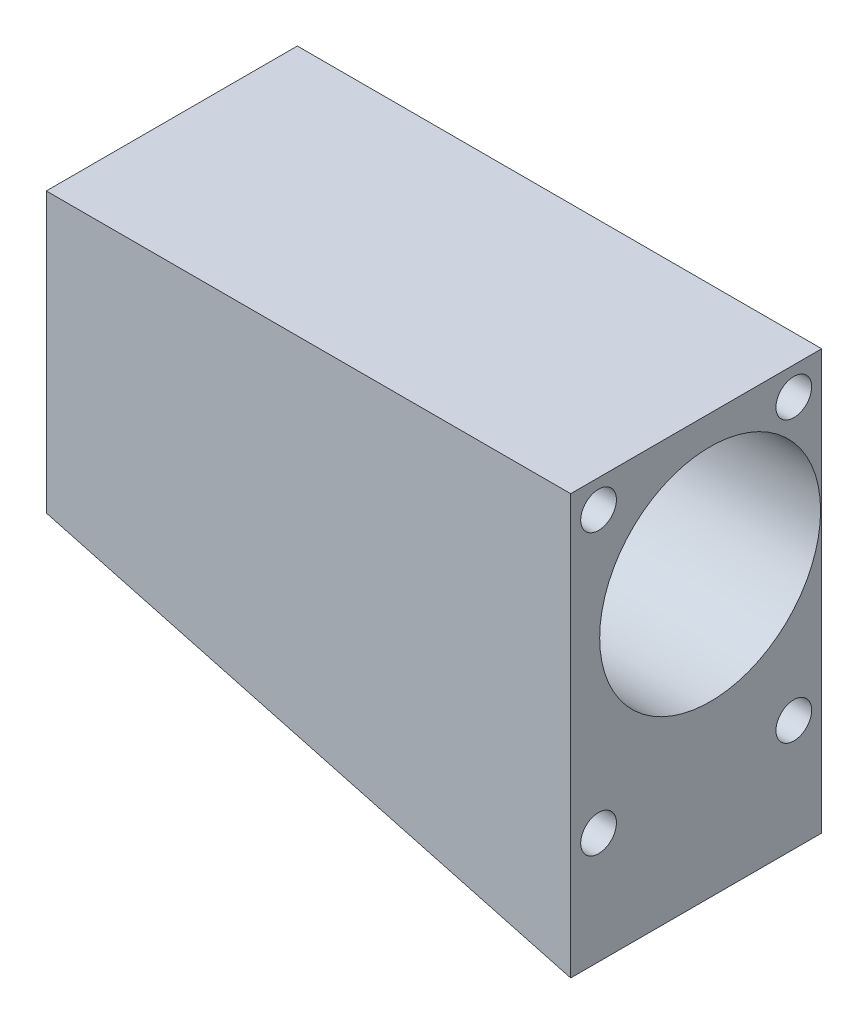
ISO-10303-21;
HEADER;
FILE_DESCRIPTION(('STEP AP214'),'2;1');
FILE_NAME('part.step','',(''),(''),'','','');
FILE_SCHEMA(('AUTOMOTIVE_DESIGN { 1 0 10303 214 1 1 1 1 }'));
ENDSEC;
DATA;
#1=APPLICATION_CONTEXT('core data for automotive mechanical design processes');
#2=APPLICATION_PROTOCOL_DEFINITION('international standard','automotive_design',2000,#1);
#3=PRODUCT_CONTEXT('',#1,'mechanical');
#4=PRODUCT('Part','Part','',(#3));
#5=PRODUCT_RELATED_PRODUCT_CATEGORY('part','',(#4));
#6=PRODUCT_DEFINITION_FORMATION('','',#4);
#7=PRODUCT_DEFINITION_CONTEXT('part definition',#1,'design');
#8=PRODUCT_DEFINITION('design','',#6,#7);
#9=PRODUCT_DEFINITION_SHAPE('','',#8);
#10=(LENGTH_UNIT() NAMED_UNIT(*) SI_UNIT(.MILLI.,.METRE.));
#11=(NAMED_UNIT(*) PLANE_ANGLE_UNIT() SI_UNIT($,.RADIAN.));
#12=(NAMED_UNIT(*) SI_UNIT($,.STERADIAN.) SOLID_ANGLE_UNIT());
#13=UNCERTAINTY_MEASURE_WITH_UNIT(LENGTH_MEASURE(1.E-05),#10,'distance_accuracy_value','');
#14=(GEOMETRIC_REPRESENTATION_CONTEXT(3) GLOBAL_UNCERTAINTY_ASSIGNED_CONTEXT((#13)) GLOBAL_UNIT_ASSIGNED_CONTEXT((#10,
#11,#12)) REPRESENTATION_CONTEXT('',''));
#15=CARTESIAN_POINT('',(0.,0.,0.));
#16=DIRECTION('',(0.,0.,1.));
#17=DIRECTION('',(1.,0.,0.));
#18=AXIS2_PLACEMENT_3D('',#15,#16,#17);
#19=CARTESIAN_POINT('',(0.,31.75,-28.575));
#20=DIRECTION('',(0.,1.,0.));
#21=DIRECTION('',(0.,0.,1.));
#22=AXIS2_PLACEMENT_3D('',#19,#20,#21);
#23=PLANE('',#22);
#24=DIRECTION('',(-1.,0.,0.));
#25=VECTOR('',#24,1.);
#26=CARTESIAN_POINT('',(0.,31.75,0.));
#27=LINE('',#26,#25);
#28=CARTESIAN_POINT('',(57.15,31.75,0.));
#29=VERTEX_POINT('',#28);
#30=CARTESIAN_POINT('',(-2.54,31.75,0.));
#31=VERTEX_POINT('',#30);
#32=EDGE_CURVE('E74',#29,#31,#27,.T.);
#33=ORIENTED_EDGE('',*,*,#32,.F.);
#34=DIRECTION('',(0.,0.,1.));
#35=VECTOR('',#34,1.);
#36=CARTESIAN_POINT('',(57.15,31.75,-28.575));
#37=LINE('',#36,#35);
#38=CARTESIAN_POINT('',(57.15,31.75,-28.575));
#39=VERTEX_POINT('',#38);
#40=EDGE_CURVE('E11',#39,#29,#37,.T.);
#41=ORIENTED_EDGE('',*,*,#40,.F.);
#42=DIRECTION('',(-1.,0.,0.));
#43=VECTOR('',#42,1.);
#44=CARTESIAN_POINT('',(0.,31.75,-28.575));
#45=LINE('',#44,#43);
#46=CARTESIAN_POINT('',(-2.54,31.75,-28.575));
#47=VERTEX_POINT('',#46);
#48=EDGE_CURVE('E41',#39,#47,#45,.T.);
#49=ORIENTED_EDGE('',*,*,#48,.T.);
#50=DIRECTION('',(0.,0.,1.));
#51=VECTOR('',#50,1.);
#52=CARTESIAN_POINT('',(-2.54,31.75,-28.575));
#53=LINE('',#52,#51);
#54=EDGE_CURVE('E102',#47,#31,#53,.T.);
#55=ORIENTED_EDGE('',*,*,#54,.T.);
#56=EDGE_LOOP('',(#33,#41,#49,#55));
#57=FACE_BOUND('',#56,.T.);
#58=ADVANCED_FACE('F32',(#57),#23,.T.);
#59=CARTESIAN_POINT('',(57.15,0.,-28.575));
#60=DIRECTION('',(1.,0.,0.));
#61=DIRECTION('',(0.,0.,-1.));
#62=AXIS2_PLACEMENT_3D('',#59,#60,#61);
#63=PLANE('',#62);
#64=CARTESIAN_POINT('',(57.15,28.575,-25.4));
#65=DIRECTION('',(1.,0.,0.));
#66=DIRECTION('',(0.,0.,-1.));
#67=AXIS2_PLACEMENT_3D('',#64,#65,#66);
#68=CIRCLE('',#67,2.032);
#69=CARTESIAN_POINT('',(57.15,28.575,-27.432));
#70=VERTEX_POINT('',#69);
#71=EDGE_CURVE('E186',#70,#70,#68,.T.);
#72=ORIENTED_EDGE('',*,*,#71,.F.);
#73=EDGE_LOOP('',(#72));
#74=FACE_BOUND('',#73,.T.);
#75=CARTESIAN_POINT('',(57.15,-3.29388729621329,-25.4));
#76=DIRECTION('',(1.,0.,0.));
#77=DIRECTION('',(0.,0.,-1.));
#78=AXIS2_PLACEMENT_3D('',#75,#76,#77);
#79=CIRCLE('',#78,2.032);
#80=CARTESIAN_POINT('',(57.15,-3.29388729621329,-27.432));
#81=VERTEX_POINT('',#80);
#82=EDGE_CURVE('E195',#81,#81,#79,.T.);
#83=ORIENTED_EDGE('',*,*,#82,.F.);
#84=EDGE_LOOP('',(#83));
#85=FACE_BOUND('',#84,.T.);
#86=CARTESIAN_POINT('',(57.15,-3.29388729621329,-3.175));
#87=DIRECTION('',(1.,0.,0.));
#88=DIRECTION('',(0.,0.,-1.));
#89=AXIS2_PLACEMENT_3D('',#86,#87,#88);
#90=CIRCLE('',#89,2.032);
#91=CARTESIAN_POINT('',(57.15,-3.29388729621329,-5.207));
#92=VERTEX_POINT('',#91);
#93=EDGE_CURVE('E201',#92,#92,#90,.T.);
#94=ORIENTED_EDGE('',*,*,#93,.F.);
#95=EDGE_LOOP('',(#94));
#96=FACE_BOUND('',#95,.T.);
#97=CARTESIAN_POINT('',(57.15,28.575,-3.175));
#98=DIRECTION('',(1.,0.,0.));
#99=DIRECTION('',(0.,0.,-1.));
#100=AXIS2_PLACEMENT_3D('',#97,#98,#99);
#101=CIRCLE('',#100,2.032);
#102=CARTESIAN_POINT('',(57.15,28.575,-5.207));
#103=VERTEX_POINT('',#102);
#104=EDGE_CURVE('E94',#103,#103,#101,.T.);
#105=ORIENTED_EDGE('',*,*,#104,.F.);
#106=EDGE_LOOP('',(#105));
#107=FACE_BOUND('',#106,.T.);
#108=CARTESIAN_POINT('',(57.15,15.875,-15.875));
#109=DIRECTION('',(-1.,0.,0.));
#110=DIRECTION('',(0.,0.,1.));
#111=AXIS2_PLACEMENT_3D('',#108,#109,#110);
#112=CIRCLE('',#111,12.573);
#113=CARTESIAN_POINT('',(57.15,15.875,-3.302));
#114=VERTEX_POINT('',#113);
#115=EDGE_CURVE('E114',#114,#114,#112,.T.);
#116=ORIENTED_EDGE('',*,*,#115,.T.);
#117=EDGE_LOOP('',(#116));
#118=FACE_BOUND('',#117,.T.);
#119=DIRECTION('',(0.,1.,0.));
#120=VECTOR('',#119,1.);
#121=CARTESIAN_POINT('',(57.15,0.,0.));
#122=LINE('',#121,#120);
#123=CARTESIAN_POINT('',(57.15,-15.9938872962133,0.));
#124=VERTEX_POINT('',#123);
#125=EDGE_CURVE('E79',#124,#29,#122,.T.);
#126=ORIENTED_EDGE('',*,*,#125,.F.);
#127=DIRECTION('',(0.,0.,1.));
#128=VECTOR('',#127,1.);
#129=CARTESIAN_POINT('',(57.15,-15.9938872962133,-28.575));
#130=LINE('',#129,#128);
#131=CARTESIAN_POINT('',(57.15,-15.9938872962133,-28.575));
#132=VERTEX_POINT('',#131);
#133=EDGE_CURVE('E77',#132,#124,#130,.T.);
#134=ORIENTED_EDGE('',*,*,#133,.F.);
#135=DIRECTION('',(0.,1.,0.));
#136=VECTOR('',#135,1.);
#137=CARTESIAN_POINT('',(57.15,0.,-28.575));
#138=LINE('',#137,#136);
#139=EDGE_CURVE('E67',#132,#39,#138,.T.);
#140=ORIENTED_EDGE('',*,*,#139,.T.);
#141=ORIENTED_EDGE('',*,*,#40,.T.);
#142=EDGE_LOOP('',(#126,#134,#140,#141));
#143=FACE_BOUND('',#142,.T.);
#144=ADVANCED_FACE('F34',(#74,#85,#96,#107,#118,#143),#63,.T.);
#145=CARTESIAN_POINT('',(0.,0.,-28.575));
#146=DIRECTION('',(0.,0.,-1.));
#147=DIRECTION('',(-1.,0.,0.));
#148=AXIS2_PLACEMENT_3D('',#145,#146,#147);
#149=PLANE('',#148);
#150=ORIENTED_EDGE('',*,*,#139,.F.);
#151=DIRECTION('',(0.96592582628907,-0.258819045102514,0.));
#152=VECTOR('',#151,1.);
#153=CARTESIAN_POINT('',(57.15,-15.9938872962133,-28.575));
#154=LINE('',#153,#152);
#155=CARTESIAN_POINT('',(-2.54,0.,-28.575));
#156=VERTEX_POINT('',#155);
#157=EDGE_CURVE('E72',#156,#132,#154,.T.);
#158=ORIENTED_EDGE('',*,*,#157,.F.);
#159=DIRECTION('',(0.,1.,0.));
#160=VECTOR('',#159,1.);
#161=CARTESIAN_POINT('',(-2.54,0.,-28.575));
#162=LINE('',#161,#160);
#163=EDGE_CURVE('E104',#156,#47,#162,.T.);
#164=ORIENTED_EDGE('',*,*,#163,.T.);
#165=ORIENTED_EDGE('',*,*,#48,.F.);
#166=EDGE_LOOP('',(#150,#158,#164,#165));
#167=FACE_BOUND('',#166,.T.);
#168=ADVANCED_FACE('F69',(#167),#149,.T.);
#169=CARTESIAN_POINT('',(0.,0.,0.));
#170=DIRECTION('',(0.,0.,-1.));
#171=DIRECTION('',(-1.,0.,0.));
#172=AXIS2_PLACEMENT_3D('',#169,#170,#171);
#173=PLANE('',#172);
#174=ORIENTED_EDGE('',*,*,#32,.T.);
#175=DIRECTION('',(0.,1.,0.));
#176=VECTOR('',#175,1.);
#177=CARTESIAN_POINT('',(-2.54,0.,0.));
#178=LINE('',#177,#176);
#179=CARTESIAN_POINT('',(-2.54,0.,0.));
#180=VERTEX_POINT('',#179);
#181=EDGE_CURVE('E107',#180,#31,#178,.T.);
#182=ORIENTED_EDGE('',*,*,#181,.F.);
#183=DIRECTION('',(0.96592582628907,-0.258819045102514,0.));
#184=VECTOR('',#183,1.);
#185=CARTESIAN_POINT('',(57.15,-15.9938872962133,0.));
#186=LINE('',#185,#184);
#187=EDGE_CURVE('E89',#180,#124,#186,.T.);
#188=ORIENTED_EDGE('',*,*,#187,.T.);
#189=ORIENTED_EDGE('',*,*,#125,.T.);
#190=EDGE_LOOP('',(#174,#182,#188,#189));
#191=FACE_BOUND('',#190,.T.);
#192=ADVANCED_FACE('F119',(#191),#173,.F.);
#193=CARTESIAN_POINT('',(57.15,15.875,-15.875));
#194=DIRECTION('',(-1.,0.,0.));
#195=DIRECTION('',(0.,0.,1.));
#196=AXIS2_PLACEMENT_3D('',#193,#194,#195);
#197=CYLINDRICAL_SURFACE('',#196,12.573);
#198=ORIENTED_EDGE('',*,*,#115,.F.);
#199=EDGE_LOOP('',(#198));
#200=FACE_BOUND('',#199,.T.);
#201=CARTESIAN_POINT('',(0.,15.875,-15.875));
#202=DIRECTION('',(1.,0.,0.));
#203=DIRECTION('',(0.,0.,-1.));
#204=AXIS2_PLACEMENT_3D('',#201,#202,#203);
#205=CIRCLE('',#204,12.573);
#206=CARTESIAN_POINT('',(0.,15.875,-28.448));
#207=VERTEX_POINT('',#206);
#208=EDGE_CURVE('E110',#207,#207,#205,.F.);
#209=ORIENTED_EDGE('',*,*,#208,.T.);
#210=EDGE_LOOP('',(#209));
#211=FACE_BOUND('',#210,.T.);
#212=ADVANCED_FACE('F131',(#200,#211),#197,.F.);
#213=CARTESIAN_POINT('',(0.,0.,-28.575));
#214=DIRECTION('',(1.,0.,0.));
#215=DIRECTION('',(0.,0.,-1.));
#216=AXIS2_PLACEMENT_3D('',#213,#214,#215);
#217=PLANE('',#216);
#218=CARTESIAN_POINT('',(0.,15.875,-15.875));
#219=DIRECTION('',(1.,0.,0.));
#220=DIRECTION('',(0.,0.,-1.));
#221=AXIS2_PLACEMENT_3D('',#218,#219,#220);
#222=CIRCLE('',#221,9.525);
#223=CARTESIAN_POINT('',(0.,15.875,-25.4));
#224=VERTEX_POINT('',#223);
#225=EDGE_CURVE('E99',#224,#224,#222,.F.);
#226=ORIENTED_EDGE('',*,*,#225,.T.);
#227=EDGE_LOOP('',(#226));
#228=FACE_BOUND('',#227,.T.);
#229=ORIENTED_EDGE('',*,*,#208,.F.);
#230=EDGE_LOOP('',(#229));
#231=FACE_BOUND('',#230,.T.);
#232=ADVANCED_FACE('F136',(#228,#231),#217,.T.);
#233=CARTESIAN_POINT('',(-2.54,0.,-28.575));
#234=DIRECTION('',(-1.,0.,0.));
#235=DIRECTION('',(0.,0.,1.));
#236=AXIS2_PLACEMENT_3D('',#233,#234,#235);
#237=PLANE('',#236);
#238=CARTESIAN_POINT('',(-2.54,15.875,-15.875));
#239=DIRECTION('',(-1.,0.,0.));
#240=DIRECTION('',(0.,0.,1.));
#241=AXIS2_PLACEMENT_3D('',#238,#239,#240);
#242=CIRCLE('',#241,9.525);
#243=CARTESIAN_POINT('',(-2.54,15.875,-6.35));
#244=VERTEX_POINT('',#243);
#245=EDGE_CURVE('E83',#244,#244,#242,.T.);
#246=ORIENTED_EDGE('',*,*,#245,.F.);
#247=EDGE_LOOP('',(#246));
#248=FACE_BOUND('',#247,.T.);
#249=ORIENTED_EDGE('',*,*,#54,.F.);
#250=ORIENTED_EDGE('',*,*,#163,.F.);
#251=DIRECTION('',(0.,0.,1.));
#252=VECTOR('',#251,1.);
#253=CARTESIAN_POINT('',(-2.54,0.,-28.575));
#254=LINE('',#253,#252);
#255=EDGE_CURVE('E88',#156,#180,#254,.T.);
#256=ORIENTED_EDGE('',*,*,#255,.T.);
#257=ORIENTED_EDGE('',*,*,#181,.T.);
#258=EDGE_LOOP('',(#249,#250,#256,#257));
#259=FACE_BOUND('',#258,.T.);
#260=ADVANCED_FACE('F122',(#248,#259),#237,.T.);
#261=CARTESIAN_POINT('',(26.9407683632075,15.875,-15.875));
#262=DIRECTION('',(-1.,0.,0.));
#263=DIRECTION('',(0.,0.,1.));
#264=AXIS2_PLACEMENT_3D('',#261,#262,#263);
#265=CYLINDRICAL_SURFACE('',#264,9.525);
#266=ORIENTED_EDGE('',*,*,#245,.T.);
#267=EDGE_LOOP('',(#266));
#268=FACE_BOUND('',#267,.T.);
#269=ORIENTED_EDGE('',*,*,#225,.F.);
#270=EDGE_LOOP('',(#269));
#271=FACE_BOUND('',#270,.T.);
#272=ADVANCED_FACE('F143',(#268,#271),#265,.F.);
#273=CARTESIAN_POINT('',(57.15,-15.9938872962133,-28.575));
#274=DIRECTION('',(-0.258819045102514,-0.96592582628907,0.));
#275=DIRECTION('',(0.96592582628907,-0.258819045102514,0.));
#276=AXIS2_PLACEMENT_3D('',#273,#274,#275);
#277=PLANE('',#276);
#278=ORIENTED_EDGE('',*,*,#187,.F.);
#279=ORIENTED_EDGE('',*,*,#255,.F.);
#280=ORIENTED_EDGE('',*,*,#157,.T.);
#281=ORIENTED_EDGE('',*,*,#133,.T.);
#282=EDGE_LOOP('',(#278,#279,#280,#281));
#283=FACE_BOUND('',#282,.T.);
#284=ADVANCED_FACE('F86',(#283),#277,.T.);
#285=CARTESIAN_POINT('',(44.45,28.575,-3.175));
#286=DIRECTION('',(1.,0.,0.));
#287=DIRECTION('',(0.,0.,-1.));
#288=AXIS2_PLACEMENT_3D('',#285,#286,#287);
#289=CYLINDRICAL_SURFACE('',#288,2.032);
#290=CARTESIAN_POINT('',(44.45,28.575,-3.175));
#291=DIRECTION('',(1.,0.,0.));
#292=DIRECTION('',(0.,0.,-1.));
#293=AXIS2_PLACEMENT_3D('',#290,#291,#292);
#294=CIRCLE('',#293,2.032);
#295=CARTESIAN_POINT('',(44.45,28.575,-5.207));
#296=VERTEX_POINT('',#295);
#297=EDGE_CURVE('E91',#296,#296,#294,.T.);
#298=ORIENTED_EDGE('',*,*,#297,.F.);
#299=EDGE_LOOP('',(#298));
#300=FACE_BOUND('',#299,.T.);
#301=ORIENTED_EDGE('',*,*,#104,.T.);
#302=EDGE_LOOP('',(#301));
#303=FACE_BOUND('',#302,.T.);
#304=ADVANCED_FACE('F150',(#300,#303),#289,.F.);
#305=CARTESIAN_POINT('',(44.45,28.575,-3.175));
#306=DIRECTION('',(1.,0.,0.));
#307=DIRECTION('',(0.,0.,-1.));
#308=AXIS2_PLACEMENT_3D('',#305,#306,#307);
#309=PLANE('',#308);
#310=ORIENTED_EDGE('',*,*,#297,.T.);
#311=EDGE_LOOP('',(#310));
#312=FACE_BOUND('',#311,.T.);
#313=ADVANCED_FACE('F153',(#312),#309,.T.);
#314=CARTESIAN_POINT('',(44.45,-3.29388729621329,-3.175));
#315=DIRECTION('',(1.,0.,0.));
#316=DIRECTION('',(0.,0.,-1.));
#317=AXIS2_PLACEMENT_3D('',#314,#315,#316);
#318=CYLINDRICAL_SURFACE('',#317,2.032);
#319=CARTESIAN_POINT('',(44.45,-3.29388729621329,-3.175));
#320=DIRECTION('',(1.,0.,0.));
#321=DIRECTION('',(0.,0.,-1.));
#322=AXIS2_PLACEMENT_3D('',#319,#320,#321);
#323=CIRCLE('',#322,2.032);
#324=CARTESIAN_POINT('',(44.45,-3.29388729621329,-5.207));
#325=VERTEX_POINT('',#324);
#326=EDGE_CURVE('E198',#325,#325,#323,.T.);
#327=ORIENTED_EDGE('',*,*,#326,.F.);
#328=EDGE_LOOP('',(#327));
#329=FACE_BOUND('',#328,.T.);
#330=ORIENTED_EDGE('',*,*,#93,.T.);
#331=EDGE_LOOP('',(#330));
#332=FACE_BOUND('',#331,.T.);
#333=ADVANCED_FACE('F157',(#329,#332),#318,.F.);
#334=CARTESIAN_POINT('',(44.45,-3.29388729621329,-3.175));
#335=DIRECTION('',(1.,0.,0.));
#336=DIRECTION('',(0.,0.,-1.));
#337=AXIS2_PLACEMENT_3D('',#334,#335,#336);
#338=PLANE('',#337);
#339=ORIENTED_EDGE('',*,*,#326,.T.);
#340=EDGE_LOOP('',(#339));
#341=FACE_BOUND('',#340,.T.);
#342=ADVANCED_FACE('F161',(#341),#338,.T.);
#343=CARTESIAN_POINT('',(44.45,-3.29388729621329,-25.4));
#344=DIRECTION('',(1.,0.,0.));
#345=DIRECTION('',(0.,0.,-1.));
#346=AXIS2_PLACEMENT_3D('',#343,#344,#345);
#347=CYLINDRICAL_SURFACE('',#346,2.032);
#348=CARTESIAN_POINT('',(44.45,-3.29388729621329,-25.4));
#349=DIRECTION('',(1.,0.,0.));
#350=DIRECTION('',(0.,0.,-1.));
#351=AXIS2_PLACEMENT_3D('',#348,#349,#350);
#352=CIRCLE('',#351,2.032);
#353=CARTESIAN_POINT('',(44.45,-3.29388729621329,-27.432));
#354=VERTEX_POINT('',#353);
#355=EDGE_CURVE('E190',#354,#354,#352,.T.);
#356=ORIENTED_EDGE('',*,*,#355,.F.);
#357=EDGE_LOOP('',(#356));
#358=FACE_BOUND('',#357,.T.);
#359=ORIENTED_EDGE('',*,*,#82,.T.);
#360=EDGE_LOOP('',(#359));
#361=FACE_BOUND('',#360,.T.);
#362=ADVANCED_FACE('F165',(#358,#361),#347,.F.);
#363=CARTESIAN_POINT('',(44.45,-3.29388729621329,-25.4));
#364=DIRECTION('',(1.,0.,0.));
#365=DIRECTION('',(0.,0.,-1.));
#366=AXIS2_PLACEMENT_3D('',#363,#364,#365);
#367=PLANE('',#366);
#368=ORIENTED_EDGE('',*,*,#355,.T.);
#369=EDGE_LOOP('',(#368));
#370=FACE_BOUND('',#369,.T.);
#371=ADVANCED_FACE('F169',(#370),#367,.T.);
#372=CARTESIAN_POINT('',(44.45,28.575,-25.4));
#373=DIRECTION('',(1.,0.,0.));
#374=DIRECTION('',(0.,0.,-1.));
#375=AXIS2_PLACEMENT_3D('',#372,#373,#374);
#376=CYLINDRICAL_SURFACE('',#375,2.032);
#377=CARTESIAN_POINT('',(44.45,28.575,-25.4));
#378=DIRECTION('',(1.,0.,0.));
#379=DIRECTION('',(0.,0.,-1.));
#380=AXIS2_PLACEMENT_3D('',#377,#378,#379);
#381=CIRCLE('',#380,2.032);
#382=CARTESIAN_POINT('',(44.45,28.575,-27.432));
#383=VERTEX_POINT('',#382);
#384=EDGE_CURVE('E185',#383,#383,#381,.T.);
#385=ORIENTED_EDGE('',*,*,#384,.F.);
#386=EDGE_LOOP('',(#385));
#387=FACE_BOUND('',#386,.T.);
#388=ORIENTED_EDGE('',*,*,#71,.T.);
#389=EDGE_LOOP('',(#388));
#390=FACE_BOUND('',#389,.T.);
#391=ADVANCED_FACE('F173',(#387,#390),#376,.F.);
#392=CARTESIAN_POINT('',(44.45,28.575,-25.4));
#393=DIRECTION('',(1.,0.,0.));
#394=DIRECTION('',(0.,0.,-1.));
#395=AXIS2_PLACEMENT_3D('',#392,#393,#394);
#396=PLANE('',#395);
#397=ORIENTED_EDGE('',*,*,#384,.T.);
#398=EDGE_LOOP('',(#397));
#399=FACE_BOUND('',#398,.T.);
#400=ADVANCED_FACE('F177',(#399),#396,.T.);
#401=CLOSED_SHELL('',(#58,#144,#168,#192,#212,#232,#260,#272,#284,#304,#313,#333,#342,#362,#371,
#391,#400));
#402=MANIFOLD_SOLID_BREP('B2',#401);
#403=ADVANCED_BREP_SHAPE_REPRESENTATION('',(#18,#402),#14);
#404=SHAPE_DEFINITION_REPRESENTATION(#9,#403);
ENDSEC;
END-ISO-10303-21;
